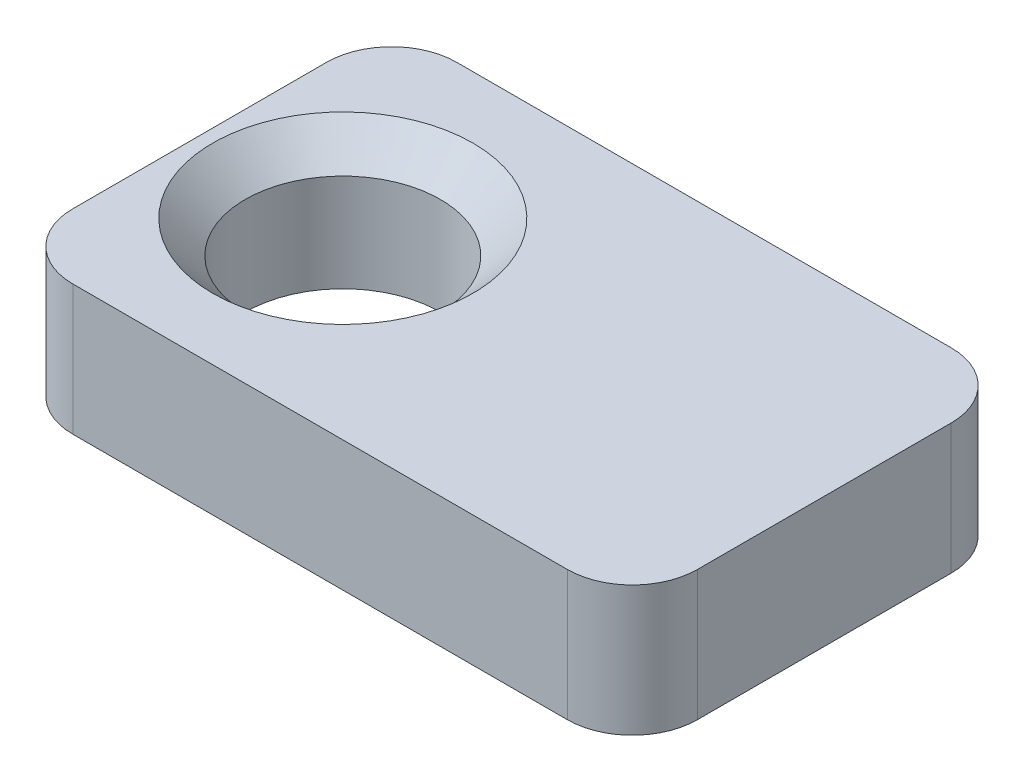
ISO-10303-21;
HEADER;
FILE_DESCRIPTION(('STEP AP214'),'2;1');
FILE_NAME('part.step','',(''),(''),'','','');
FILE_SCHEMA(('AUTOMOTIVE_DESIGN { 1 0 10303 214 1 1 1 1 }'));
ENDSEC;
DATA;
#1=APPLICATION_CONTEXT('core data for automotive mechanical design processes');
#2=APPLICATION_PROTOCOL_DEFINITION('international standard','automotive_design',2000,#1);
#3=PRODUCT_CONTEXT('',#1,'mechanical');
#4=PRODUCT('Part','Part','',(#3));
#5=PRODUCT_RELATED_PRODUCT_CATEGORY('part','',(#4));
#6=PRODUCT_DEFINITION_FORMATION('','',#4);
#7=PRODUCT_DEFINITION_CONTEXT('part definition',#1,'design');
#8=PRODUCT_DEFINITION('design','',#6,#7);
#9=PRODUCT_DEFINITION_SHAPE('','',#8);
#10=(LENGTH_UNIT() NAMED_UNIT(*) SI_UNIT(.MILLI.,.METRE.));
#11=(NAMED_UNIT(*) PLANE_ANGLE_UNIT() SI_UNIT($,.RADIAN.));
#12=(NAMED_UNIT(*) SI_UNIT($,.STERADIAN.) SOLID_ANGLE_UNIT());
#13=UNCERTAINTY_MEASURE_WITH_UNIT(LENGTH_MEASURE(1.E-05),#10,'distance_accuracy_value','');
#14=(GEOMETRIC_REPRESENTATION_CONTEXT(3) GLOBAL_UNCERTAINTY_ASSIGNED_CONTEXT((#13)) GLOBAL_UNIT_ASSIGNED_CONTEXT((#10,
#11,#12)) REPRESENTATION_CONTEXT('',''));
#15=CARTESIAN_POINT('',(0.,0.,0.));
#16=DIRECTION('',(0.,0.,1.));
#17=DIRECTION('',(1.,0.,0.));
#18=AXIS2_PLACEMENT_3D('',#15,#16,#17);
#19=CARTESIAN_POINT('',(0.,1.,0.));
#20=DIRECTION('',(1.,0.,0.));
#21=DIRECTION('',(0.,0.,-1.));
#22=AXIS2_PLACEMENT_3D('',#19,#20,#21);
#23=PLANE('',#22);
#24=DIRECTION('',(0.,0.,1.));
#25=VECTOR('',#24,1.);
#26=CARTESIAN_POINT('',(0.,1.,0.));
#27=LINE('',#26,#25);
#28=CARTESIAN_POINT('',(0.,1.,-2.45));
#29=VERTEX_POINT('',#28);
#30=CARTESIAN_POINT('',(0.,1.,-0.5));
#31=VERTEX_POINT('',#30);
#32=EDGE_CURVE('E128',#29,#31,#27,.T.);
#33=ORIENTED_EDGE('',*,*,#32,.F.);
#34=DIRECTION('',(0.,-1.,0.));
#35=VECTOR('',#34,1.);
#36=CARTESIAN_POINT('',(0.,1.,-2.45));
#37=LINE('',#36,#35);
#38=CARTESIAN_POINT('',(0.,0.,-2.45));
#39=VERTEX_POINT('',#38);
#40=EDGE_CURVE('E11',#29,#39,#37,.T.);
#41=ORIENTED_EDGE('',*,*,#40,.T.);
#42=DIRECTION('',(0.,0.,1.));
#43=VECTOR('',#42,1.);
#44=CARTESIAN_POINT('',(0.,0.,0.));
#45=LINE('',#44,#43);
#46=CARTESIAN_POINT('',(0.,0.,-0.5));
#47=VERTEX_POINT('',#46);
#48=EDGE_CURVE('E130',#39,#47,#45,.T.);
#49=ORIENTED_EDGE('',*,*,#48,.T.);
#50=DIRECTION('',(0.,-1.,0.));
#51=VECTOR('',#50,1.);
#52=CARTESIAN_POINT('',(0.,1.,-0.5));
#53=LINE('',#52,#51);
#54=EDGE_CURVE('E41',#47,#31,#53,.F.);
#55=ORIENTED_EDGE('',*,*,#54,.T.);
#56=EDGE_LOOP('',(#33,#41,#49,#55));
#57=FACE_BOUND('',#56,.T.);
#58=ADVANCED_FACE('F33',(#57),#23,.F.);
#59=CARTESIAN_POINT('',(0.,1.,0.));
#60=DIRECTION('',(0.,0.,-1.));
#61=DIRECTION('',(-1.,0.,0.));
#62=AXIS2_PLACEMENT_3D('',#59,#60,#61);
#63=PLANE('',#62);
#64=DIRECTION('',(1.,0.,0.));
#65=VECTOR('',#64,1.);
#66=CARTESIAN_POINT('',(0.,0.,0.));
#67=LINE('',#66,#65);
#68=CARTESIAN_POINT('',(0.5,0.,0.));
#69=VERTEX_POINT('',#68);
#70=CARTESIAN_POINT('',(4.3,0.,0.));
#71=VERTEX_POINT('',#70);
#72=EDGE_CURVE('E126',#69,#71,#67,.T.);
#73=ORIENTED_EDGE('',*,*,#72,.T.);
#74=DIRECTION('',(0.,-1.,0.));
#75=VECTOR('',#74,1.);
#76=CARTESIAN_POINT('',(4.3,1.,0.));
#77=LINE('',#76,#75);
#78=CARTESIAN_POINT('',(4.3,1.,0.));
#79=VERTEX_POINT('',#78);
#80=EDGE_CURVE('E105',#71,#79,#77,.F.);
#81=ORIENTED_EDGE('',*,*,#80,.T.);
#82=DIRECTION('',(1.,0.,0.));
#83=VECTOR('',#82,1.);
#84=CARTESIAN_POINT('',(0.,1.,0.));
#85=LINE('',#84,#83);
#86=CARTESIAN_POINT('',(0.5,1.,0.));
#87=VERTEX_POINT('',#86);
#88=EDGE_CURVE('E166',#87,#79,#85,.T.);
#89=ORIENTED_EDGE('',*,*,#88,.F.);
#90=DIRECTION('',(0.,-1.,0.));
#91=VECTOR('',#90,1.);
#92=CARTESIAN_POINT('',(0.5,1.,0.));
#93=LINE('',#92,#91);
#94=EDGE_CURVE('E110',#87,#69,#93,.T.);
#95=ORIENTED_EDGE('',*,*,#94,.T.);
#96=EDGE_LOOP('',(#73,#81,#89,#95));
#97=FACE_BOUND('',#96,.T.);
#98=ADVANCED_FACE('F170',(#97),#63,.F.);
#99=CARTESIAN_POINT('',(4.8,1.,0.));
#100=DIRECTION('',(-1.,0.,0.));
#101=DIRECTION('',(0.,0.,1.));
#102=AXIS2_PLACEMENT_3D('',#99,#100,#101);
#103=PLANE('',#102);
#104=DIRECTION('',(0.,0.,-1.));
#105=VECTOR('',#104,1.);
#106=CARTESIAN_POINT('',(4.8,1.,0.));
#107=LINE('',#106,#105);
#108=CARTESIAN_POINT('',(4.8,1.,-0.5));
#109=VERTEX_POINT('',#108);
#110=CARTESIAN_POINT('',(4.8,1.,-2.45));
#111=VERTEX_POINT('',#110);
#112=EDGE_CURVE('E119',#109,#111,#107,.T.);
#113=ORIENTED_EDGE('',*,*,#112,.F.);
#114=DIRECTION('',(0.,-1.,0.));
#115=VECTOR('',#114,1.);
#116=CARTESIAN_POINT('',(4.8,1.,-0.5));
#117=LINE('',#116,#115);
#118=CARTESIAN_POINT('',(4.8,0.,-0.5));
#119=VERTEX_POINT('',#118);
#120=EDGE_CURVE('E104',#109,#119,#117,.T.);
#121=ORIENTED_EDGE('',*,*,#120,.T.);
#122=DIRECTION('',(0.,0.,-1.));
#123=VECTOR('',#122,1.);
#124=CARTESIAN_POINT('',(4.8,0.,0.));
#125=LINE('',#124,#123);
#126=CARTESIAN_POINT('',(4.8,0.,-2.45));
#127=VERTEX_POINT('',#126);
#128=EDGE_CURVE('E117',#119,#127,#125,.T.);
#129=ORIENTED_EDGE('',*,*,#128,.T.);
#130=DIRECTION('',(0.,-1.,0.));
#131=VECTOR('',#130,1.);
#132=CARTESIAN_POINT('',(4.8,1.,-2.45));
#133=LINE('',#132,#131);
#134=EDGE_CURVE('E121',#127,#111,#133,.F.);
#135=ORIENTED_EDGE('',*,*,#134,.T.);
#136=EDGE_LOOP('',(#113,#121,#129,#135));
#137=FACE_BOUND('',#136,.T.);
#138=ADVANCED_FACE('F116',(#137),#103,.F.);
#139=CARTESIAN_POINT('',(0.,1.,-2.95));
#140=DIRECTION('',(0.,0.,1.));
#141=DIRECTION('',(1.,0.,0.));
#142=AXIS2_PLACEMENT_3D('',#139,#140,#141);
#143=PLANE('',#142);
#144=DIRECTION('',(-1.,0.,0.));
#145=VECTOR('',#144,1.);
#146=CARTESIAN_POINT('',(0.,1.,-2.95));
#147=LINE('',#146,#145);
#148=CARTESIAN_POINT('',(4.3,1.,-2.95));
#149=VERTEX_POINT('',#148);
#150=CARTESIAN_POINT('',(0.5,1.,-2.95));
#151=VERTEX_POINT('',#150);
#152=EDGE_CURVE('E134',#149,#151,#147,.T.);
#153=ORIENTED_EDGE('',*,*,#152,.F.);
#154=DIRECTION('',(0.,-1.,0.));
#155=VECTOR('',#154,1.);
#156=CARTESIAN_POINT('',(4.3,1.,-2.95));
#157=LINE('',#156,#155);
#158=CARTESIAN_POINT('',(4.3,0.,-2.95));
#159=VERTEX_POINT('',#158);
#160=EDGE_CURVE('E151',#149,#159,#157,.T.);
#161=ORIENTED_EDGE('',*,*,#160,.T.);
#162=DIRECTION('',(-1.,0.,0.));
#163=VECTOR('',#162,1.);
#164=CARTESIAN_POINT('',(0.,0.,-2.95));
#165=LINE('',#164,#163);
#166=CARTESIAN_POINT('',(0.5,0.,-2.95));
#167=VERTEX_POINT('',#166);
#168=EDGE_CURVE('E125',#159,#167,#165,.T.);
#169=ORIENTED_EDGE('',*,*,#168,.T.);
#170=DIRECTION('',(0.,-1.,0.));
#171=VECTOR('',#170,1.);
#172=CARTESIAN_POINT('',(0.5,1.,-2.95));
#173=LINE('',#172,#171);
#174=EDGE_CURVE('E48',#167,#151,#173,.F.);
#175=ORIENTED_EDGE('',*,*,#174,.T.);
#176=EDGE_LOOP('',(#153,#161,#169,#175));
#177=FACE_BOUND('',#176,.T.);
#178=ADVANCED_FACE('F188',(#177),#143,.F.);
#179=CARTESIAN_POINT('',(0.,1.,0.));
#180=DIRECTION('',(0.,-1.,0.));
#181=DIRECTION('',(0.,0.,-1.));
#182=AXIS2_PLACEMENT_3D('',#179,#180,#181);
#183=PLANE('',#182);
#184=CARTESIAN_POINT('',(1.1,1.,-1.475));
#185=DIRECTION('',(0.,1.,0.));
#186=DIRECTION('',(0.,0.,1.));
#187=AXIS2_PLACEMENT_3D('',#184,#185,#186);
#188=CIRCLE('',#187,1.);
#189=CARTESIAN_POINT('',(1.1,1.,-0.475));
#190=VERTEX_POINT('',#189);
#191=EDGE_CURVE('E181',#190,#190,#188,.T.);
#192=ORIENTED_EDGE('',*,*,#191,.F.);
#193=EDGE_LOOP('',(#192));
#194=FACE_BOUND('',#193,.T.);
#195=ORIENTED_EDGE('',*,*,#88,.T.);
#196=CARTESIAN_POINT('',(4.3,1.,-0.5));
#197=DIRECTION('',(0.,-1.,0.));
#198=DIRECTION('',(0.,0.,-1.));
#199=AXIS2_PLACEMENT_3D('',#196,#197,#198);
#200=CIRCLE('',#199,0.5);
#201=EDGE_CURVE('E148',#79,#109,#200,.F.);
#202=ORIENTED_EDGE('',*,*,#201,.T.);
#203=ORIENTED_EDGE('',*,*,#112,.T.);
#204=CARTESIAN_POINT('',(4.3,1.,-2.45));
#205=DIRECTION('',(0.,-1.,0.));
#206=DIRECTION('',(0.,0.,-1.));
#207=AXIS2_PLACEMENT_3D('',#204,#205,#206);
#208=CIRCLE('',#207,0.5);
#209=EDGE_CURVE('E55',#111,#149,#208,.F.);
#210=ORIENTED_EDGE('',*,*,#209,.T.);
#211=ORIENTED_EDGE('',*,*,#152,.T.);
#212=CARTESIAN_POINT('',(0.5,1.,-2.45));
#213=DIRECTION('',(0.,-1.,0.));
#214=DIRECTION('',(0.,0.,-1.));
#215=AXIS2_PLACEMENT_3D('',#212,#213,#214);
#216=CIRCLE('',#215,0.5);
#217=EDGE_CURVE('E145',#151,#29,#216,.F.);
#218=ORIENTED_EDGE('',*,*,#217,.T.);
#219=ORIENTED_EDGE('',*,*,#32,.T.);
#220=CARTESIAN_POINT('',(0.5,1.,-0.5));
#221=DIRECTION('',(0.,-1.,0.));
#222=DIRECTION('',(0.,0.,-1.));
#223=AXIS2_PLACEMENT_3D('',#220,#221,#222);
#224=CIRCLE('',#223,0.5);
#225=EDGE_CURVE('E143',#31,#87,#224,.F.);
#226=ORIENTED_EDGE('',*,*,#225,.T.);
#227=EDGE_LOOP('',(#195,#202,#203,#210,#211,#218,#219,#226));
#228=FACE_BOUND('',#227,.T.);
#229=ADVANCED_FACE('F163',(#194,#228),#183,.F.);
#230=CARTESIAN_POINT('',(0.,0.,0.));
#231=DIRECTION('',(0.,-1.,0.));
#232=DIRECTION('',(0.,0.,-1.));
#233=AXIS2_PLACEMENT_3D('',#230,#231,#232);
#234=PLANE('',#233);
#235=CARTESIAN_POINT('',(1.1,0.,-1.475));
#236=DIRECTION('',(0.,1.,0.));
#237=DIRECTION('',(0.,0.,1.));
#238=AXIS2_PLACEMENT_3D('',#235,#236,#237);
#239=CIRCLE('',#238,0.75);
#240=CARTESIAN_POINT('',(1.1,0.,-0.725000000000001));
#241=VERTEX_POINT('',#240);
#242=EDGE_CURVE('E171',#241,#241,#239,.T.);
#243=ORIENTED_EDGE('',*,*,#242,.T.);
#244=EDGE_LOOP('',(#243));
#245=FACE_BOUND('',#244,.T.);
#246=ORIENTED_EDGE('',*,*,#128,.F.);
#247=CARTESIAN_POINT('',(4.3,0.,-0.5));
#248=DIRECTION('',(0.,-1.,0.));
#249=DIRECTION('',(0.,0.,-1.));
#250=AXIS2_PLACEMENT_3D('',#247,#248,#249);
#251=CIRCLE('',#250,0.5);
#252=EDGE_CURVE('E100',#119,#71,#251,.T.);
#253=ORIENTED_EDGE('',*,*,#252,.T.);
#254=ORIENTED_EDGE('',*,*,#72,.F.);
#255=CARTESIAN_POINT('',(0.5,0.,-0.5));
#256=DIRECTION('',(0.,-1.,0.));
#257=DIRECTION('',(0.,0.,-1.));
#258=AXIS2_PLACEMENT_3D('',#255,#256,#257);
#259=CIRCLE('',#258,0.5);
#260=EDGE_CURVE('E120',#69,#47,#259,.T.);
#261=ORIENTED_EDGE('',*,*,#260,.T.);
#262=ORIENTED_EDGE('',*,*,#48,.F.);
#263=CARTESIAN_POINT('',(0.5,0.,-2.45));
#264=DIRECTION('',(0.,-1.,0.));
#265=DIRECTION('',(0.,0.,-1.));
#266=AXIS2_PLACEMENT_3D('',#263,#264,#265);
#267=CIRCLE('',#266,0.5);
#268=EDGE_CURVE('E137',#39,#167,#267,.T.);
#269=ORIENTED_EDGE('',*,*,#268,.T.);
#270=ORIENTED_EDGE('',*,*,#168,.F.);
#271=CARTESIAN_POINT('',(4.3,0.,-2.45));
#272=DIRECTION('',(0.,-1.,0.));
#273=DIRECTION('',(0.,0.,-1.));
#274=AXIS2_PLACEMENT_3D('',#271,#272,#273);
#275=CIRCLE('',#274,0.5);
#276=EDGE_CURVE('E111',#159,#127,#275,.T.);
#277=ORIENTED_EDGE('',*,*,#276,.T.);
#278=EDGE_LOOP('',(#246,#253,#254,#261,#262,#269,#270,#277));
#279=FACE_BOUND('',#278,.T.);
#280=ADVANCED_FACE('F123',(#245,#279),#234,.T.);
#281=CARTESIAN_POINT('',(1.1,1.,-1.475));
#282=DIRECTION('',(0.,1.,0.));
#283=DIRECTION('',(0.,0.,1.));
#284=AXIS2_PLACEMENT_3D('',#281,#282,#283);
#285=CYLINDRICAL_SURFACE('',#284,0.75);
#286=ORIENTED_EDGE('',*,*,#242,.F.);
#287=EDGE_LOOP('',(#286));
#288=FACE_BOUND('',#287,.T.);
#289=CARTESIAN_POINT('',(1.1,0.75,-1.475));
#290=DIRECTION('',(0.,1.,0.));
#291=DIRECTION('',(0.,0.,1.));
#292=AXIS2_PLACEMENT_3D('',#289,#290,#291);
#293=CIRCLE('',#292,0.75);
#294=CARTESIAN_POINT('',(1.1,0.75,-0.725000000000001));
#295=VERTEX_POINT('',#294);
#296=EDGE_CURVE('E173',#295,#295,#293,.T.);
#297=ORIENTED_EDGE('',*,*,#296,.T.);
#298=EDGE_LOOP('',(#297));
#299=FACE_BOUND('',#298,.T.);
#300=ADVANCED_FACE('F194',(#288,#299),#285,.F.);
#301=CARTESIAN_POINT('',(1.1,1.,-1.475));
#302=DIRECTION('',(0.,1.,0.));
#303=DIRECTION('',(0.,0.,1.));
#304=AXIS2_PLACEMENT_3D('',#301,#302,#303);
#305=CONICAL_SURFACE('',#304,1.,0.785398163397447);
#306=ORIENTED_EDGE('',*,*,#296,.F.);
#307=EDGE_LOOP('',(#306));
#308=FACE_BOUND('',#307,.T.);
#309=ORIENTED_EDGE('',*,*,#191,.T.);
#310=EDGE_LOOP('',(#309));
#311=FACE_BOUND('',#310,.T.);
#312=ADVANCED_FACE('F185',(#308,#311),#305,.F.);
#313=CARTESIAN_POINT('',(4.3,1.,-0.5));
#314=DIRECTION('',(0.,-1.,0.));
#315=DIRECTION('',(0.,0.,-1.));
#316=AXIS2_PLACEMENT_3D('',#313,#314,#315);
#317=CYLINDRICAL_SURFACE('',#316,0.5);
#318=ORIENTED_EDGE('',*,*,#201,.F.);
#319=ORIENTED_EDGE('',*,*,#80,.F.);
#320=ORIENTED_EDGE('',*,*,#252,.F.);
#321=ORIENTED_EDGE('',*,*,#120,.F.);
#322=EDGE_LOOP('',(#318,#319,#320,#321));
#323=FACE_BOUND('',#322,.T.);
#324=ADVANCED_FACE('F103',(#323),#317,.T.);
#325=CARTESIAN_POINT('',(4.3,1.,-2.45));
#326=DIRECTION('',(0.,-1.,0.));
#327=DIRECTION('',(0.,0.,-1.));
#328=AXIS2_PLACEMENT_3D('',#325,#326,#327);
#329=CYLINDRICAL_SURFACE('',#328,0.5);
#330=ORIENTED_EDGE('',*,*,#209,.F.);
#331=ORIENTED_EDGE('',*,*,#134,.F.);
#332=ORIENTED_EDGE('',*,*,#276,.F.);
#333=ORIENTED_EDGE('',*,*,#160,.F.);
#334=EDGE_LOOP('',(#330,#331,#332,#333));
#335=FACE_BOUND('',#334,.T.);
#336=ADVANCED_FACE('F209',(#335),#329,.T.);
#337=CARTESIAN_POINT('',(0.5,1.,-2.45));
#338=DIRECTION('',(0.,-1.,0.));
#339=DIRECTION('',(0.,0.,-1.));
#340=AXIS2_PLACEMENT_3D('',#337,#338,#339);
#341=CYLINDRICAL_SURFACE('',#340,0.5);
#342=ORIENTED_EDGE('',*,*,#217,.F.);
#343=ORIENTED_EDGE('',*,*,#174,.F.);
#344=ORIENTED_EDGE('',*,*,#268,.F.);
#345=ORIENTED_EDGE('',*,*,#40,.F.);
#346=EDGE_LOOP('',(#342,#343,#344,#345));
#347=FACE_BOUND('',#346,.T.);
#348=ADVANCED_FACE('F211',(#347),#341,.T.);
#349=CARTESIAN_POINT('',(0.5,1.,-0.5));
#350=DIRECTION('',(0.,-1.,0.));
#351=DIRECTION('',(0.,0.,-1.));
#352=AXIS2_PLACEMENT_3D('',#349,#350,#351);
#353=CYLINDRICAL_SURFACE('',#352,0.5);
#354=ORIENTED_EDGE('',*,*,#225,.F.);
#355=ORIENTED_EDGE('',*,*,#54,.F.);
#356=ORIENTED_EDGE('',*,*,#260,.F.);
#357=ORIENTED_EDGE('',*,*,#94,.F.);
#358=EDGE_LOOP('',(#354,#355,#356,#357));
#359=FACE_BOUND('',#358,.T.);
#360=ADVANCED_FACE('F35',(#359),#353,.T.);
#361=CLOSED_SHELL('',(#58,#98,#138,#178,#229,#280,#300,#312,#324,#336,#348,#360));
#362=MANIFOLD_SOLID_BREP('B2',#361);
#363=ADVANCED_BREP_SHAPE_REPRESENTATION('',(#18,#362),#14);
#364=SHAPE_DEFINITION_REPRESENTATION(#9,#363);
ENDSEC;
END-ISO-10303-21;
